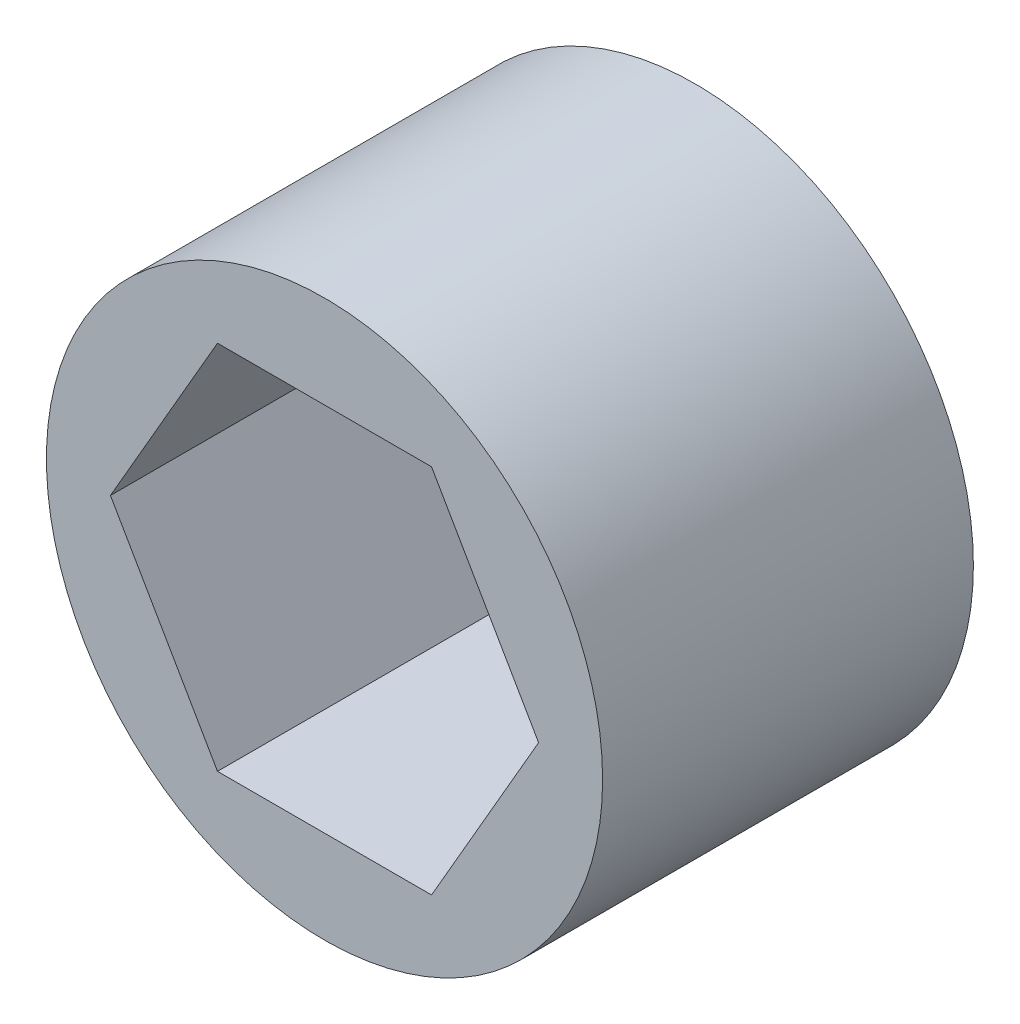
ISO-10303-21;
HEADER;
FILE_DESCRIPTION(('STEP AP214'),'2;1');
FILE_NAME('part.step','',(''),(''),'','','');
FILE_SCHEMA(('AUTOMOTIVE_DESIGN { 1 0 10303 214 1 1 1 1 }'));
ENDSEC;
DATA;
#1=APPLICATION_CONTEXT('core data for automotive mechanical design processes');
#2=APPLICATION_PROTOCOL_DEFINITION('international standard','automotive_design',2000,#1);
#3=PRODUCT_CONTEXT('',#1,'mechanical');
#4=PRODUCT('Part','Part','',(#3));
#5=PRODUCT_RELATED_PRODUCT_CATEGORY('part','',(#4));
#6=PRODUCT_DEFINITION_FORMATION('','',#4);
#7=PRODUCT_DEFINITION_CONTEXT('part definition',#1,'design');
#8=PRODUCT_DEFINITION('design','',#6,#7);
#9=PRODUCT_DEFINITION_SHAPE('','',#8);
#10=(LENGTH_UNIT() NAMED_UNIT(*) SI_UNIT(.MILLI.,.METRE.));
#11=(NAMED_UNIT(*) PLANE_ANGLE_UNIT() SI_UNIT($,.RADIAN.));
#12=(NAMED_UNIT(*) SI_UNIT($,.STERADIAN.) SOLID_ANGLE_UNIT());
#13=UNCERTAINTY_MEASURE_WITH_UNIT(LENGTH_MEASURE(1.E-05),#10,'distance_accuracy_value','');
#14=(GEOMETRIC_REPRESENTATION_CONTEXT(3) GLOBAL_UNCERTAINTY_ASSIGNED_CONTEXT((#13)) GLOBAL_UNIT_ASSIGNED_CONTEXT((#10,
#11,#12)) REPRESENTATION_CONTEXT('',''));
#15=CARTESIAN_POINT('',(0.,0.,0.));
#16=DIRECTION('',(0.,0.,1.));
#17=DIRECTION('',(1.,0.,0.));
#18=AXIS2_PLACEMENT_3D('',#15,#16,#17);
#19=CARTESIAN_POINT('',(0.,0.,12.7));
#20=DIRECTION('',(0.,0.,1.));
#21=DIRECTION('',(1.,0.,0.));
#22=AXIS2_PLACEMENT_3D('',#19,#20,#21);
#23=PLANE('',#22);
#24=CARTESIAN_POINT('',(0.,0.,12.7));
#25=DIRECTION('',(0.,0.,1.));
#26=DIRECTION('',(1.,0.,0.));
#27=AXIS2_PLACEMENT_3D('',#24,#25,#26);
#28=CIRCLE('',#27,9.525);
#29=CARTESIAN_POINT('',(9.525,0.,12.7));
#30=VERTEX_POINT('',#29);
#31=EDGE_CURVE('E11',#30,#30,#28,.T.);
#32=ORIENTED_EDGE('',*,*,#31,.T.);
#33=EDGE_LOOP('',(#32));
#34=FACE_BOUND('',#33,.T.);
#35=DIRECTION('',(-0.500000000000001,0.866025403784438,0.));
#36=VECTOR('',#35,1.);
#37=CARTESIAN_POINT('',(7.33234841870821,0.,12.7));
#38=LINE('',#37,#36);
#39=CARTESIAN_POINT('',(7.33234841870821,0.,12.7));
#40=VERTEX_POINT('',#39);
#41=CARTESIAN_POINT('',(3.66617420935409,6.34999999999998,12.7));
#42=VERTEX_POINT('',#41);
#43=EDGE_CURVE('E100',#40,#42,#38,.T.);
#44=ORIENTED_EDGE('',*,*,#43,.F.);
#45=DIRECTION('',(0.499999999999995,0.866025403784441,0.));
#46=VECTOR('',#45,1.);
#47=CARTESIAN_POINT('',(3.66617420935418,-6.34999999999992,12.7));
#48=LINE('',#47,#46);
#49=CARTESIAN_POINT('',(3.66617420935418,-6.34999999999992,12.7));
#50=VERTEX_POINT('',#49);
#51=EDGE_CURVE('E92',#50,#40,#48,.T.);
#52=ORIENTED_EDGE('',*,*,#51,.F.);
#53=DIRECTION('',(1.,0.,0.));
#54=VECTOR('',#53,1.);
#55=CARTESIAN_POINT('',(-3.66617420935405,-6.35,12.7));
#56=LINE('',#55,#54);
#57=CARTESIAN_POINT('',(-3.66617420935405,-6.35,12.7));
#58=VERTEX_POINT('',#57);
#59=EDGE_CURVE('E120',#58,#50,#56,.T.);
#60=ORIENTED_EDGE('',*,*,#59,.F.);
#61=DIRECTION('',(0.500000000000007,-0.866025403784435,0.));
#62=VECTOR('',#61,1.);
#63=CARTESIAN_POINT('',(-7.33234841870821,0.,12.7));
#64=LINE('',#63,#62);
#65=CARTESIAN_POINT('',(-7.33234841870821,0.,12.7));
#66=VERTEX_POINT('',#65);
#67=EDGE_CURVE('E118',#66,#58,#64,.T.);
#68=ORIENTED_EDGE('',*,*,#67,.F.);
#69=DIRECTION('',(-0.499999999999995,-0.866025403784441,0.));
#70=VECTOR('',#69,1.);
#71=CARTESIAN_POINT('',(-3.66617420935413,6.34999999999995,12.7));
#72=LINE('',#71,#70);
#73=CARTESIAN_POINT('',(-3.66617420935413,6.34999999999995,12.7));
#74=VERTEX_POINT('',#73);
#75=EDGE_CURVE('E114',#74,#66,#72,.T.);
#76=ORIENTED_EDGE('',*,*,#75,.F.);
#77=DIRECTION('',(-1.,0.,0.));
#78=VECTOR('',#77,1.);
#79=CARTESIAN_POINT('',(3.66617420935409,6.34999999999998,12.7));
#80=LINE('',#79,#78);
#81=EDGE_CURVE('E112',#42,#74,#80,.T.);
#82=ORIENTED_EDGE('',*,*,#81,.F.);
#83=EDGE_LOOP('',(#44,#52,#60,#68,#76,#82));
#84=FACE_BOUND('',#83,.T.);
#85=ADVANCED_FACE('F39',(#34,#84),#23,.T.);
#86=CARTESIAN_POINT('',(0.,0.,0.));
#87=DIRECTION('',(0.,0.,1.));
#88=DIRECTION('',(1.,0.,0.));
#89=AXIS2_PLACEMENT_3D('',#86,#87,#88);
#90=PLANE('',#89);
#91=CARTESIAN_POINT('',(0.,0.,0.));
#92=DIRECTION('',(0.,0.,1.));
#93=DIRECTION('',(1.,0.,0.));
#94=AXIS2_PLACEMENT_3D('',#91,#92,#93);
#95=CIRCLE('',#94,9.525);
#96=CARTESIAN_POINT('',(9.525,0.,0.));
#97=VERTEX_POINT('',#96);
#98=EDGE_CURVE('E43',#97,#97,#95,.T.);
#99=ORIENTED_EDGE('',*,*,#98,.F.);
#100=EDGE_LOOP('',(#99));
#101=FACE_BOUND('',#100,.T.);
#102=DIRECTION('',(0.499999999999995,0.866025403784441,0.));
#103=VECTOR('',#102,1.);
#104=CARTESIAN_POINT('',(3.66617420935418,-6.34999999999992,0.));
#105=LINE('',#104,#103);
#106=CARTESIAN_POINT('',(3.66617420935418,-6.34999999999992,0.));
#107=VERTEX_POINT('',#106);
#108=CARTESIAN_POINT('',(7.33234841870821,0.,0.));
#109=VERTEX_POINT('',#108);
#110=EDGE_CURVE('E62',#107,#109,#105,.T.);
#111=ORIENTED_EDGE('',*,*,#110,.T.);
#112=DIRECTION('',(-0.500000000000001,0.866025403784438,0.));
#113=VECTOR('',#112,1.);
#114=CARTESIAN_POINT('',(7.33234841870821,0.,0.));
#115=LINE('',#114,#113);
#116=CARTESIAN_POINT('',(3.66617420935409,6.34999999999998,0.));
#117=VERTEX_POINT('',#116);
#118=EDGE_CURVE('E107',#109,#117,#115,.T.);
#119=ORIENTED_EDGE('',*,*,#118,.T.);
#120=DIRECTION('',(-1.,0.,0.));
#121=VECTOR('',#120,1.);
#122=CARTESIAN_POINT('',(3.66617420935409,6.34999999999998,0.));
#123=LINE('',#122,#121);
#124=CARTESIAN_POINT('',(-3.66617420935413,6.34999999999995,0.));
#125=VERTEX_POINT('',#124);
#126=EDGE_CURVE('E124',#117,#125,#123,.T.);
#127=ORIENTED_EDGE('',*,*,#126,.T.);
#128=DIRECTION('',(-0.499999999999995,-0.866025403784441,0.));
#129=VECTOR('',#128,1.);
#130=CARTESIAN_POINT('',(-3.66617420935413,6.34999999999995,0.));
#131=LINE('',#130,#129);
#132=CARTESIAN_POINT('',(-7.33234841870821,0.,0.));
#133=VERTEX_POINT('',#132);
#134=EDGE_CURVE('E127',#125,#133,#131,.T.);
#135=ORIENTED_EDGE('',*,*,#134,.T.);
#136=DIRECTION('',(0.500000000000007,-0.866025403784435,0.));
#137=VECTOR('',#136,1.);
#138=CARTESIAN_POINT('',(-7.33234841870821,0.,0.));
#139=LINE('',#138,#137);
#140=CARTESIAN_POINT('',(-3.66617420935405,-6.35,0.));
#141=VERTEX_POINT('',#140);
#142=EDGE_CURVE('E130',#133,#141,#139,.T.);
#143=ORIENTED_EDGE('',*,*,#142,.T.);
#144=DIRECTION('',(1.,0.,0.));
#145=VECTOR('',#144,1.);
#146=CARTESIAN_POINT('',(-3.66617420935405,-6.35,0.));
#147=LINE('',#146,#145);
#148=EDGE_CURVE('E101',#141,#107,#147,.T.);
#149=ORIENTED_EDGE('',*,*,#148,.T.);
#150=EDGE_LOOP('',(#111,#119,#127,#135,#143,#149));
#151=FACE_BOUND('',#150,.T.);
#152=ADVANCED_FACE('F147',(#101,#151),#90,.F.);
#153=CARTESIAN_POINT('',(0.,0.,12.7));
#154=DIRECTION('',(0.,0.,-1.));
#155=DIRECTION('',(-1.,0.,0.));
#156=AXIS2_PLACEMENT_3D('',#153,#154,#155);
#157=CYLINDRICAL_SURFACE('',#156,9.525);
#158=ORIENTED_EDGE('',*,*,#31,.F.);
#159=EDGE_LOOP('',(#158));
#160=FACE_BOUND('',#159,.T.);
#161=ORIENTED_EDGE('',*,*,#98,.T.);
#162=EDGE_LOOP('',(#161));
#163=FACE_BOUND('',#162,.T.);
#164=ADVANCED_FACE('F41',(#160,#163),#157,.T.);
#165=CARTESIAN_POINT('',(3.66617420935418,-6.34999999999992,12.7));
#166=DIRECTION('',(-0.866025403784441,0.499999999999995,0.));
#167=DIRECTION('',(-0.499999999999995,-0.866025403784441,0.));
#168=AXIS2_PLACEMENT_3D('',#165,#166,#167);
#169=PLANE('',#168);
#170=ORIENTED_EDGE('',*,*,#110,.F.);
#171=DIRECTION('',(0.,0.,-1.));
#172=VECTOR('',#171,1.);
#173=CARTESIAN_POINT('',(3.66617420935418,-6.34999999999992,12.7));
#174=LINE('',#173,#172);
#175=EDGE_CURVE('E96',#50,#107,#174,.T.);
#176=ORIENTED_EDGE('',*,*,#175,.F.);
#177=ORIENTED_EDGE('',*,*,#51,.T.);
#178=DIRECTION('',(0.,0.,-1.));
#179=VECTOR('',#178,1.);
#180=CARTESIAN_POINT('',(7.33234841870821,0.,12.7));
#181=LINE('',#180,#179);
#182=EDGE_CURVE('E95',#40,#109,#181,.T.);
#183=ORIENTED_EDGE('',*,*,#182,.T.);
#184=EDGE_LOOP('',(#170,#176,#177,#183));
#185=FACE_BOUND('',#184,.T.);
#186=ADVANCED_FACE('F94',(#185),#169,.T.);
#187=CARTESIAN_POINT('',(7.33234841870821,0.,12.7));
#188=DIRECTION('',(-0.866025403784438,-0.500000000000001,0.));
#189=DIRECTION('',(0.500000000000001,-0.866025403784438,0.));
#190=AXIS2_PLACEMENT_3D('',#187,#188,#189);
#191=PLANE('',#190);
#192=ORIENTED_EDGE('',*,*,#118,.F.);
#193=ORIENTED_EDGE('',*,*,#182,.F.);
#194=ORIENTED_EDGE('',*,*,#43,.T.);
#195=DIRECTION('',(0.,0.,-1.));
#196=VECTOR('',#195,1.);
#197=CARTESIAN_POINT('',(3.66617420935409,6.34999999999998,12.7));
#198=LINE('',#197,#196);
#199=EDGE_CURVE('E108',#42,#117,#198,.T.);
#200=ORIENTED_EDGE('',*,*,#199,.T.);
#201=EDGE_LOOP('',(#192,#193,#194,#200));
#202=FACE_BOUND('',#201,.T.);
#203=ADVANCED_FACE('F104',(#202),#191,.T.);
#204=CARTESIAN_POINT('',(3.66617420935409,6.34999999999998,12.7));
#205=DIRECTION('',(0.,-1.,0.));
#206=DIRECTION('',(1.,0.,0.));
#207=AXIS2_PLACEMENT_3D('',#204,#205,#206);
#208=PLANE('',#207);
#209=ORIENTED_EDGE('',*,*,#126,.F.);
#210=ORIENTED_EDGE('',*,*,#199,.F.);
#211=ORIENTED_EDGE('',*,*,#81,.T.);
#212=DIRECTION('',(0.,0.,-1.));
#213=VECTOR('',#212,1.);
#214=CARTESIAN_POINT('',(-3.66617420935413,6.34999999999995,12.7));
#215=LINE('',#214,#213);
#216=EDGE_CURVE('E139',#74,#125,#215,.T.);
#217=ORIENTED_EDGE('',*,*,#216,.T.);
#218=EDGE_LOOP('',(#209,#210,#211,#217));
#219=FACE_BOUND('',#218,.T.);
#220=ADVANCED_FACE('F143',(#219),#208,.T.);
#221=CARTESIAN_POINT('',(-3.66617420935413,6.34999999999995,12.7));
#222=DIRECTION('',(0.866025403784441,-0.499999999999995,0.));
#223=DIRECTION('',(0.499999999999995,0.866025403784442,0.));
#224=AXIS2_PLACEMENT_3D('',#221,#222,#223);
#225=PLANE('',#224);
#226=ORIENTED_EDGE('',*,*,#134,.F.);
#227=ORIENTED_EDGE('',*,*,#216,.F.);
#228=ORIENTED_EDGE('',*,*,#75,.T.);
#229=DIRECTION('',(0.,0.,-1.));
#230=VECTOR('',#229,1.);
#231=CARTESIAN_POINT('',(-7.33234841870821,0.,12.7));
#232=LINE('',#231,#230);
#233=EDGE_CURVE('E137',#66,#133,#232,.T.);
#234=ORIENTED_EDGE('',*,*,#233,.T.);
#235=EDGE_LOOP('',(#226,#227,#228,#234));
#236=FACE_BOUND('',#235,.T.);
#237=ADVANCED_FACE('F155',(#236),#225,.T.);
#238=CARTESIAN_POINT('',(-7.33234841870821,0.,12.7));
#239=DIRECTION('',(0.866025403784434,0.500000000000007,0.));
#240=DIRECTION('',(-0.500000000000007,0.866025403784435,0.));
#241=AXIS2_PLACEMENT_3D('',#238,#239,#240);
#242=PLANE('',#241);
#243=ORIENTED_EDGE('',*,*,#142,.F.);
#244=ORIENTED_EDGE('',*,*,#233,.F.);
#245=ORIENTED_EDGE('',*,*,#67,.T.);
#246=DIRECTION('',(0.,0.,-1.));
#247=VECTOR('',#246,1.);
#248=CARTESIAN_POINT('',(-3.66617420935405,-6.35,12.7));
#249=LINE('',#248,#247);
#250=EDGE_CURVE('E54',#58,#141,#249,.T.);
#251=ORIENTED_EDGE('',*,*,#250,.T.);
#252=EDGE_LOOP('',(#243,#244,#245,#251));
#253=FACE_BOUND('',#252,.T.);
#254=ADVANCED_FACE('F153',(#253),#242,.T.);
#255=CARTESIAN_POINT('',(-3.66617420935405,-6.35,12.7));
#256=DIRECTION('',(0.,1.,0.));
#257=DIRECTION('',(-1.,0.,0.));
#258=AXIS2_PLACEMENT_3D('',#255,#256,#257);
#259=PLANE('',#258);
#260=ORIENTED_EDGE('',*,*,#148,.F.);
#261=ORIENTED_EDGE('',*,*,#250,.F.);
#262=ORIENTED_EDGE('',*,*,#59,.T.);
#263=ORIENTED_EDGE('',*,*,#175,.T.);
#264=EDGE_LOOP('',(#260,#261,#262,#263));
#265=FACE_BOUND('',#264,.T.);
#266=ADVANCED_FACE('F149',(#265),#259,.T.);
#267=CLOSED_SHELL('',(#85,#152,#164,#186,#203,#220,#237,#254,#266));
#268=MANIFOLD_SOLID_BREP('B2',#267);
#269=ADVANCED_BREP_SHAPE_REPRESENTATION('',(#18,#268),#14);
#270=SHAPE_DEFINITION_REPRESENTATION(#9,#269);
ENDSEC;
END-ISO-10303-21;
